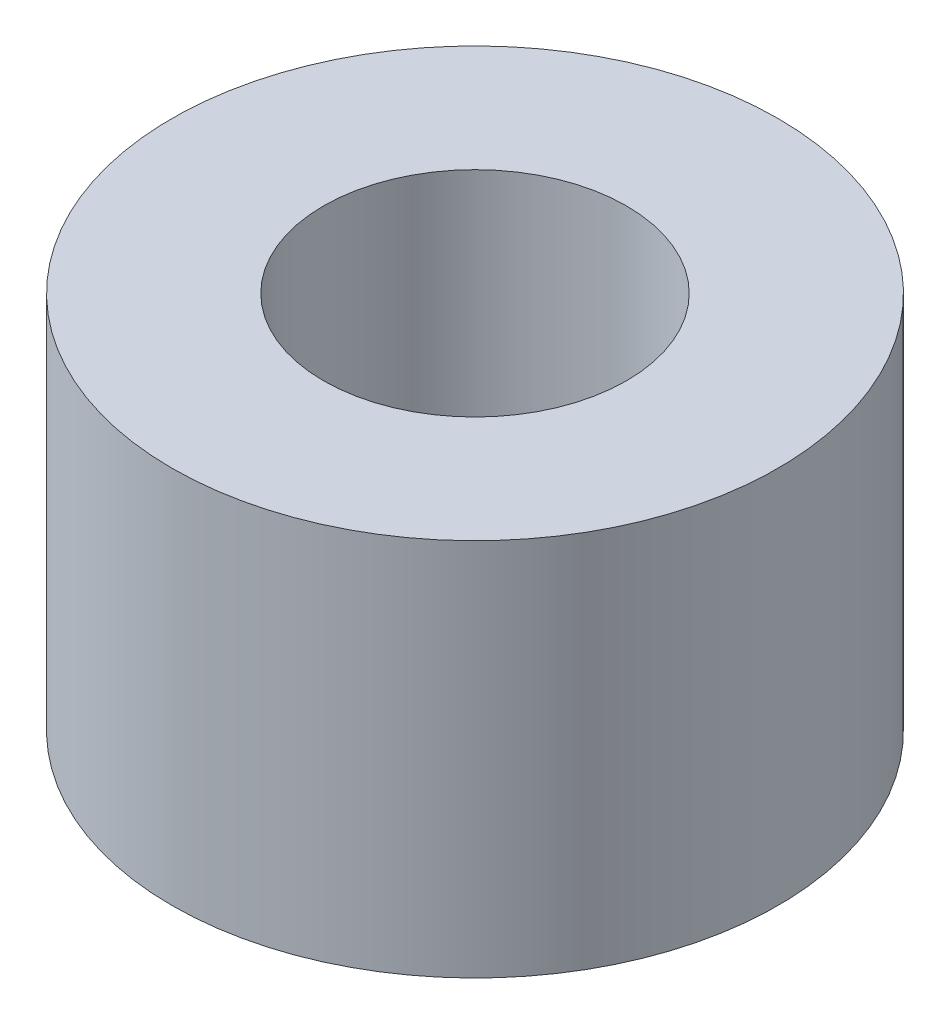
ISO-10303-21;
HEADER;
FILE_DESCRIPTION(('STEP AP214'),'2;1');
FILE_NAME('part.step','',(''),(''),'','','');
FILE_SCHEMA(('AUTOMOTIVE_DESIGN { 1 0 10303 214 1 1 1 1 }'));
ENDSEC;
DATA;
#1=APPLICATION_CONTEXT('core data for automotive mechanical design processes');
#2=APPLICATION_PROTOCOL_DEFINITION('international standard','automotive_design',2000,#1);
#3=PRODUCT_CONTEXT('',#1,'mechanical');
#4=PRODUCT('Part','Part','',(#3));
#5=PRODUCT_RELATED_PRODUCT_CATEGORY('part','',(#4));
#6=PRODUCT_DEFINITION_FORMATION('','',#4);
#7=PRODUCT_DEFINITION_CONTEXT('part definition',#1,'design');
#8=PRODUCT_DEFINITION('design','',#6,#7);
#9=PRODUCT_DEFINITION_SHAPE('','',#8);
#10=(LENGTH_UNIT() NAMED_UNIT(*) SI_UNIT(.MILLI.,.METRE.));
#11=(NAMED_UNIT(*) PLANE_ANGLE_UNIT() SI_UNIT($,.RADIAN.));
#12=(NAMED_UNIT(*) SI_UNIT($,.STERADIAN.) SOLID_ANGLE_UNIT());
#13=UNCERTAINTY_MEASURE_WITH_UNIT(LENGTH_MEASURE(1.E-05),#10,'distance_accuracy_value','');
#14=(GEOMETRIC_REPRESENTATION_CONTEXT(3) GLOBAL_UNCERTAINTY_ASSIGNED_CONTEXT((#13)) GLOBAL_UNIT_ASSIGNED_CONTEXT((#10,
#11,#12)) REPRESENTATION_CONTEXT('',''));
#15=CARTESIAN_POINT('',(0.,0.,0.));
#16=DIRECTION('',(0.,0.,1.));
#17=DIRECTION('',(1.,0.,0.));
#18=AXIS2_PLACEMENT_3D('',#15,#16,#17);
#19=CARTESIAN_POINT('',(5.58481322395702,5.,0.));
#20=DIRECTION('',(0.,1.,0.));
#21=DIRECTION('',(0.,0.,1.));
#22=AXIS2_PLACEMENT_3D('',#19,#20,#21);
#23=PLANE('',#22);
#24=CARTESIAN_POINT('',(5.58481322395702,5.,0.));
#25=DIRECTION('',(0.,1.,0.));
#26=DIRECTION('',(0.,0.,1.));
#27=AXIS2_PLACEMENT_3D('',#24,#25,#26);
#28=CIRCLE('',#27,4.);
#29=CARTESIAN_POINT('',(5.58481322395702,5.,4.));
#30=VERTEX_POINT('',#29);
#31=EDGE_CURVE('E10',#30,#30,#28,.T.);
#32=ORIENTED_EDGE('',*,*,#31,.T.);
#33=EDGE_LOOP('',(#32));
#34=FACE_BOUND('',#33,.T.);
#35=CARTESIAN_POINT('',(5.58481322395702,5.,0.));
#36=DIRECTION('',(0.,1.,0.));
#37=DIRECTION('',(0.,0.,1.));
#38=AXIS2_PLACEMENT_3D('',#35,#36,#37);
#39=CIRCLE('',#38,2.);
#40=CARTESIAN_POINT('',(5.58481322395702,5.,2.));
#41=VERTEX_POINT('',#40);
#42=EDGE_CURVE('E50',#41,#41,#39,.T.);
#43=ORIENTED_EDGE('',*,*,#42,.F.);
#44=EDGE_LOOP('',(#43));
#45=FACE_BOUND('',#44,.T.);
#46=ADVANCED_FACE('F37',(#34,#45),#23,.T.);
#47=CARTESIAN_POINT('',(5.58481322395702,0.,0.));
#48=DIRECTION('',(0.,1.,0.));
#49=DIRECTION('',(0.,0.,1.));
#50=AXIS2_PLACEMENT_3D('',#47,#48,#49);
#51=PLANE('',#50);
#52=CARTESIAN_POINT('',(5.58481322395702,0.,0.));
#53=DIRECTION('',(0.,1.,0.));
#54=DIRECTION('',(0.,0.,1.));
#55=AXIS2_PLACEMENT_3D('',#52,#53,#54);
#56=CIRCLE('',#55,4.);
#57=CARTESIAN_POINT('',(5.58481322395702,0.,4.));
#58=VERTEX_POINT('',#57);
#59=EDGE_CURVE('E41',#58,#58,#56,.T.);
#60=ORIENTED_EDGE('',*,*,#59,.F.);
#61=EDGE_LOOP('',(#60));
#62=FACE_BOUND('',#61,.T.);
#63=CARTESIAN_POINT('',(5.58481322395702,0.,0.));
#64=DIRECTION('',(0.,1.,0.));
#65=DIRECTION('',(0.,0.,1.));
#66=AXIS2_PLACEMENT_3D('',#63,#64,#65);
#67=CIRCLE('',#66,2.);
#68=CARTESIAN_POINT('',(5.58481322395702,0.,2.));
#69=VERTEX_POINT('',#68);
#70=EDGE_CURVE('E52',#69,#69,#67,.T.);
#71=ORIENTED_EDGE('',*,*,#70,.T.);
#72=EDGE_LOOP('',(#71));
#73=FACE_BOUND('',#72,.T.);
#74=ADVANCED_FACE('F64',(#62,#73),#51,.F.);
#75=CARTESIAN_POINT('',(5.58481322395702,5.,0.));
#76=DIRECTION('',(0.,-1.,0.));
#77=DIRECTION('',(0.,0.,-1.));
#78=AXIS2_PLACEMENT_3D('',#75,#76,#77);
#79=CYLINDRICAL_SURFACE('',#78,4.);
#80=ORIENTED_EDGE('',*,*,#31,.F.);
#81=EDGE_LOOP('',(#80));
#82=FACE_BOUND('',#81,.T.);
#83=ORIENTED_EDGE('',*,*,#59,.T.);
#84=EDGE_LOOP('',(#83));
#85=FACE_BOUND('',#84,.T.);
#86=ADVANCED_FACE('F39',(#82,#85),#79,.T.);
#87=CARTESIAN_POINT('',(5.58481322395702,5.,0.));
#88=DIRECTION('',(0.,-1.,0.));
#89=DIRECTION('',(0.,0.,-1.));
#90=AXIS2_PLACEMENT_3D('',#87,#88,#89);
#91=CYLINDRICAL_SURFACE('',#90,2.);
#92=ORIENTED_EDGE('',*,*,#42,.T.);
#93=EDGE_LOOP('',(#92));
#94=FACE_BOUND('',#93,.T.);
#95=ORIENTED_EDGE('',*,*,#70,.F.);
#96=EDGE_LOOP('',(#95));
#97=FACE_BOUND('',#96,.T.);
#98=ADVANCED_FACE('F60',(#94,#97),#91,.F.);
#99=CLOSED_SHELL('',(#46,#74,#86,#98));
#100=MANIFOLD_SOLID_BREP('B2',#99);
#101=ADVANCED_BREP_SHAPE_REPRESENTATION('',(#18,#100),#14);
#102=SHAPE_DEFINITION_REPRESENTATION(#9,#101);
ENDSEC;
END-ISO-10303-21;
